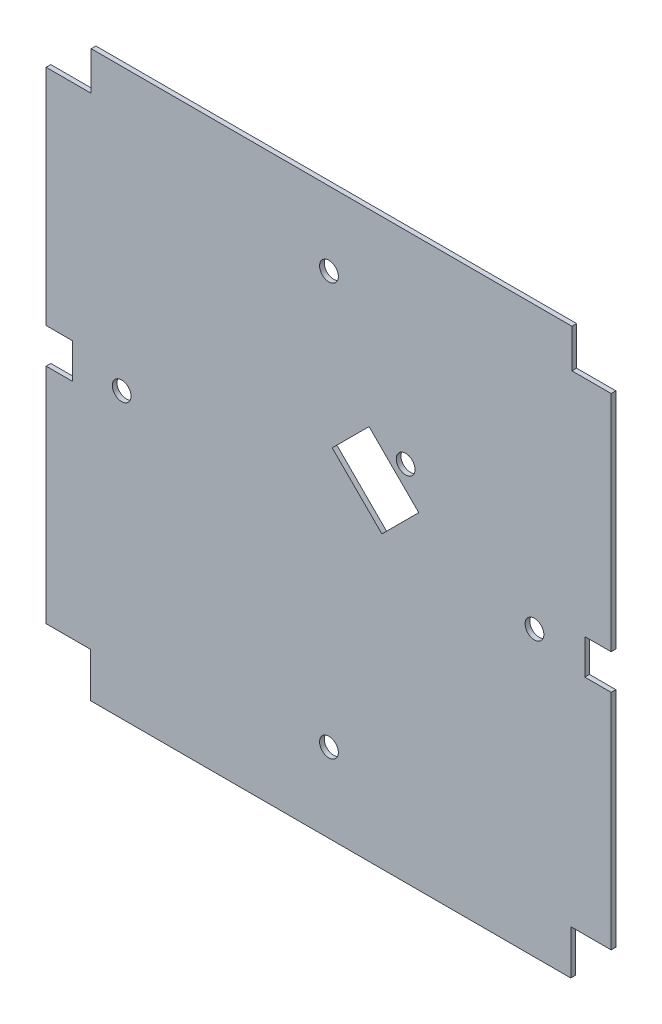
ISO-10303-21;
HEADER;
FILE_DESCRIPTION(('STEP AP214'),'2;1');
FILE_NAME('part.step','',(''),(''),'','','');
FILE_SCHEMA(('AUTOMOTIVE_DESIGN { 1 0 10303 214 1 1 1 1 }'));
ENDSEC;
DATA;
#1=APPLICATION_CONTEXT('core data for automotive mechanical design processes');
#2=APPLICATION_PROTOCOL_DEFINITION('international standard','automotive_design',2000,#1);
#3=PRODUCT_CONTEXT('',#1,'mechanical');
#4=PRODUCT('Part','Part','',(#3));
#5=PRODUCT_RELATED_PRODUCT_CATEGORY('part','',(#4));
#6=PRODUCT_DEFINITION_FORMATION('','',#4);
#7=PRODUCT_DEFINITION_CONTEXT('part definition',#1,'design');
#8=PRODUCT_DEFINITION('design','',#6,#7);
#9=PRODUCT_DEFINITION_SHAPE('','',#8);
#10=(LENGTH_UNIT() NAMED_UNIT(*) SI_UNIT(.MILLI.,.METRE.));
#11=(NAMED_UNIT(*) PLANE_ANGLE_UNIT() SI_UNIT($,.RADIAN.));
#12=(NAMED_UNIT(*) SI_UNIT($,.STERADIAN.) SOLID_ANGLE_UNIT());
#13=UNCERTAINTY_MEASURE_WITH_UNIT(LENGTH_MEASURE(1.E-05),#10,'distance_accuracy_value','');
#14=(GEOMETRIC_REPRESENTATION_CONTEXT(3) GLOBAL_UNCERTAINTY_ASSIGNED_CONTEXT((#13)) GLOBAL_UNIT_ASSIGNED_CONTEXT((#10,
#11,#12)) REPRESENTATION_CONTEXT('',''));
#15=CARTESIAN_POINT('',(0.,0.,0.));
#16=DIRECTION('',(0.,0.,1.));
#17=DIRECTION('',(1.,0.,0.));
#18=AXIS2_PLACEMENT_3D('',#15,#16,#17);
#19=CARTESIAN_POINT('',(0.,0.,0.8));
#20=DIRECTION('',(0.,0.,1.));
#21=DIRECTION('',(1.,0.,0.));
#22=AXIS2_PLACEMENT_3D('',#19,#20,#21);
#23=PLANE('',#22);
#24=CARTESIAN_POINT('',(-5.62473267197009,1.12696317266224,0.8));
#25=DIRECTION('',(0.,0.,1.));
#26=DIRECTION('',(1.,0.,0.));
#27=AXIS2_PLACEMENT_3D('',#24,#25,#26);
#28=CIRCLE('',#27,1.6);
#29=CARTESIAN_POINT('',(-4.02473267197009,1.12696317266224,0.8));
#30=VERTEX_POINT('',#29);
#31=EDGE_CURVE('E229',#30,#30,#28,.T.);
#32=ORIENTED_EDGE('',*,*,#31,.F.);
#33=EDGE_LOOP('',(#32));
#34=FACE_BOUND('',#33,.T.);
#35=CARTESIAN_POINT('',(-18.7247326719701,-47.2730368273378,0.8));
#36=DIRECTION('',(0.,0.,1.));
#37=DIRECTION('',(1.,0.,0.));
#38=AXIS2_PLACEMENT_3D('',#35,#36,#37);
#39=CIRCLE('',#38,1.6);
#40=CARTESIAN_POINT('',(-17.1247326719701,-47.2730368273378,0.8));
#41=VERTEX_POINT('',#40);
#42=EDGE_CURVE('E232',#41,#41,#39,.T.);
#43=ORIENTED_EDGE('',*,*,#42,.F.);
#44=EDGE_LOOP('',(#43));
#45=FACE_BOUND('',#44,.T.);
#46=CARTESIAN_POINT('',(16.3752673280299,-12.2730368273378,0.8));
#47=DIRECTION('',(0.,0.,1.));
#48=DIRECTION('',(1.,0.,0.));
#49=AXIS2_PLACEMENT_3D('',#46,#47,#48);
#50=CIRCLE('',#49,1.6);
#51=CARTESIAN_POINT('',(17.9752673280299,-12.2730368273378,0.8));
#52=VERTEX_POINT('',#51);
#53=EDGE_CURVE('E236',#52,#52,#50,.T.);
#54=ORIENTED_EDGE('',*,*,#53,.F.);
#55=EDGE_LOOP('',(#54));
#56=FACE_BOUND('',#55,.T.);
#57=CARTESIAN_POINT('',(-54.1247326719701,-12.2730368273378,0.8));
#58=DIRECTION('',(0.,0.,1.));
#59=DIRECTION('',(1.,0.,0.));
#60=AXIS2_PLACEMENT_3D('',#57,#58,#59);
#61=CIRCLE('',#60,1.6);
#62=CARTESIAN_POINT('',(-52.5247326719701,-12.2730368273378,0.8));
#63=VERTEX_POINT('',#62);
#64=EDGE_CURVE('E239',#63,#63,#61,.T.);
#65=ORIENTED_EDGE('',*,*,#64,.F.);
#66=EDGE_LOOP('',(#65));
#67=FACE_BOUND('',#66,.T.);
#68=CARTESIAN_POINT('',(-18.7247326719703,23.1269631726623,0.8));
#69=DIRECTION('',(0.,0.,1.));
#70=DIRECTION('',(1.,0.,0.));
#71=AXIS2_PLACEMENT_3D('',#68,#69,#70);
#72=CIRCLE('',#71,1.6000000000002);
#73=CARTESIAN_POINT('',(-17.1247326719701,23.1269631726623,0.8));
#74=VERTEX_POINT('',#73);
#75=EDGE_CURVE('E242',#74,#74,#72,.T.);
#76=ORIENTED_EDGE('',*,*,#75,.F.);
#77=EDGE_LOOP('',(#76));
#78=FACE_BOUND('',#77,.T.);
#79=DIRECTION('',(0.,1.,0.));
#80=VECTOR('',#79,1.);
#81=CARTESIAN_POINT('',(-59.42473267197,0.,0.8));
#82=LINE('',#81,#80);
#83=CARTESIAN_POINT('',(-59.4247326719701,-60.7730368273378,0.8));
#84=VERTEX_POINT('',#83);
#85=CARTESIAN_POINT('',(-59.4247326719701,-53.1730368273378,0.8));
#86=VERTEX_POINT('',#85);
#87=EDGE_CURVE('E245',#84,#86,#82,.T.);
#88=ORIENTED_EDGE('',*,*,#87,.F.);
#89=DIRECTION('',(1.,0.,0.));
#90=VECTOR('',#89,1.);
#91=CARTESIAN_POINT('',(0.,-60.7730368273378,0.8));
#92=LINE('',#91,#90);
#93=CARTESIAN_POINT('',(22.5752673280299,-60.7730368273378,0.8));
#94=VERTEX_POINT('',#93);
#95=EDGE_CURVE('E248',#84,#94,#92,.T.);
#96=ORIENTED_EDGE('',*,*,#95,.T.);
#97=DIRECTION('',(0.,1.,0.));
#98=VECTOR('',#97,1.);
#99=CARTESIAN_POINT('',(22.5752673280298,0.,0.8));
#100=LINE('',#99,#98);
#101=CARTESIAN_POINT('',(22.5752673280299,-53.1730368273378,0.8));
#102=VERTEX_POINT('',#101);
#103=EDGE_CURVE('E251',#94,#102,#100,.T.);
#104=ORIENTED_EDGE('',*,*,#103,.T.);
#105=DIRECTION('',(-1.,0.,0.));
#106=VECTOR('',#105,1.);
#107=CARTESIAN_POINT('',(0.,-53.1730368273378,0.8));
#108=LINE('',#107,#106);
#109=CARTESIAN_POINT('',(29.4752673280299,-53.1730368273378,0.8));
#110=VERTEX_POINT('',#109);
#111=EDGE_CURVE('E253',#110,#102,#108,.T.);
#112=ORIENTED_EDGE('',*,*,#111,.F.);
#113=DIRECTION('',(0.,-1.,0.));
#114=VECTOR('',#113,1.);
#115=CARTESIAN_POINT('',(29.4752673280299,0.,0.8));
#116=LINE('',#115,#114);
#117=CARTESIAN_POINT('',(29.4752673280299,-15.0730368273378,0.8));
#118=VERTEX_POINT('',#117);
#119=EDGE_CURVE('E256',#118,#110,#116,.T.);
#120=ORIENTED_EDGE('',*,*,#119,.F.);
#121=DIRECTION('',(-1.,0.,0.));
#122=VECTOR('',#121,1.);
#123=CARTESIAN_POINT('',(0.,-15.0730368273378,0.8));
#124=LINE('',#123,#122);
#125=CARTESIAN_POINT('',(24.9752673280299,-15.0730368273378,0.8));
#126=VERTEX_POINT('',#125);
#127=EDGE_CURVE('E259',#118,#126,#124,.T.);
#128=ORIENTED_EDGE('',*,*,#127,.T.);
#129=DIRECTION('',(0.,1.,0.));
#130=VECTOR('',#129,1.);
#131=CARTESIAN_POINT('',(24.9752673280299,0.,0.8));
#132=LINE('',#131,#130);
#133=CARTESIAN_POINT('',(24.9752673280299,-9.07303682733776,0.8));
#134=VERTEX_POINT('',#133);
#135=EDGE_CURVE('E263',#126,#134,#132,.T.);
#136=ORIENTED_EDGE('',*,*,#135,.T.);
#137=DIRECTION('',(-1.,0.,0.));
#138=VECTOR('',#137,1.);
#139=CARTESIAN_POINT('',(0.,-9.07303682733776,0.8));
#140=LINE('',#139,#138);
#141=CARTESIAN_POINT('',(29.4752673280299,-9.07303682733776,0.8));
#142=VERTEX_POINT('',#141);
#143=EDGE_CURVE('E265',#142,#134,#140,.T.);
#144=ORIENTED_EDGE('',*,*,#143,.F.);
#145=CARTESIAN_POINT('',(29.4752673280299,29.1269631726622,0.8));
#146=VERTEX_POINT('',#145);
#147=EDGE_CURVE('E260',#146,#142,#116,.T.);
#148=ORIENTED_EDGE('',*,*,#147,.F.);
#149=DIRECTION('',(-1.,0.,0.));
#150=VECTOR('',#149,1.);
#151=CARTESIAN_POINT('',(0.,29.1269631726622,0.8));
#152=LINE('',#151,#150);
#153=CARTESIAN_POINT('',(22.7752673280299,29.1269631726622,0.8));
#154=VERTEX_POINT('',#153);
#155=EDGE_CURVE('E268',#146,#154,#152,.T.);
#156=ORIENTED_EDGE('',*,*,#155,.T.);
#157=DIRECTION('',(0.,-1.,0.));
#158=VECTOR('',#157,1.);
#159=CARTESIAN_POINT('',(22.7752673280299,0.,0.8));
#160=LINE('',#159,#158);
#161=CARTESIAN_POINT('',(22.7752673280299,35.7269631726623,0.8));
#162=VERTEX_POINT('',#161);
#163=EDGE_CURVE('E270',#162,#154,#160,.T.);
#164=ORIENTED_EDGE('',*,*,#163,.F.);
#165=DIRECTION('',(1.,0.,0.));
#166=VECTOR('',#165,1.);
#167=CARTESIAN_POINT('',(0.,35.7269631726623,0.8));
#168=LINE('',#167,#166);
#169=CARTESIAN_POINT('',(-59.3247326719701,35.7269631726622,0.8));
#170=VERTEX_POINT('',#169);
#171=EDGE_CURVE('E273',#170,#162,#168,.T.);
#172=ORIENTED_EDGE('',*,*,#171,.F.);
#173=DIRECTION('',(0.,-1.,0.));
#174=VECTOR('',#173,1.);
#175=CARTESIAN_POINT('',(-59.3247326719701,0.,0.8));
#176=LINE('',#175,#174);
#177=CARTESIAN_POINT('',(-59.3247326719701,29.1269631726622,0.8));
#178=VERTEX_POINT('',#177);
#179=EDGE_CURVE('E276',#170,#178,#176,.T.);
#180=ORIENTED_EDGE('',*,*,#179,.T.);
#181=DIRECTION('',(1.,0.,0.));
#182=VECTOR('',#181,1.);
#183=CARTESIAN_POINT('',(0.,29.1269631726622,0.8));
#184=LINE('',#183,#182);
#185=CARTESIAN_POINT('',(-67.0247326719701,29.1269631726622,0.8));
#186=VERTEX_POINT('',#185);
#187=EDGE_CURVE('E278',#186,#178,#184,.T.);
#188=ORIENTED_EDGE('',*,*,#187,.F.);
#189=DIRECTION('',(0.,-1.,0.));
#190=VECTOR('',#189,1.);
#191=CARTESIAN_POINT('',(-67.0247326719701,0.,0.8));
#192=LINE('',#191,#190);
#193=CARTESIAN_POINT('',(-67.0247326719701,-9.07303682733776,0.8));
#194=VERTEX_POINT('',#193);
#195=EDGE_CURVE('E281',#186,#194,#192,.T.);
#196=ORIENTED_EDGE('',*,*,#195,.T.);
#197=DIRECTION('',(1.,0.,0.));
#198=VECTOR('',#197,1.);
#199=CARTESIAN_POINT('',(0.,-9.07303682733776,0.8));
#200=LINE('',#199,#198);
#201=CARTESIAN_POINT('',(-62.5247326719701,-9.07303682733776,0.8));
#202=VERTEX_POINT('',#201);
#203=EDGE_CURVE('E284',#194,#202,#200,.T.);
#204=ORIENTED_EDGE('',*,*,#203,.T.);
#205=DIRECTION('',(0.,-1.,0.));
#206=VECTOR('',#205,1.);
#207=CARTESIAN_POINT('',(-62.52473267197,1.44617495460321E-13,0.8));
#208=LINE('',#207,#206);
#209=CARTESIAN_POINT('',(-62.5247326719701,-15.0730368273378,0.8));
#210=VERTEX_POINT('',#209);
#211=EDGE_CURVE('E288',#202,#210,#208,.T.);
#212=ORIENTED_EDGE('',*,*,#211,.T.);
#213=DIRECTION('',(1.,0.,0.));
#214=VECTOR('',#213,1.);
#215=CARTESIAN_POINT('',(0.,-15.0730368273378,0.8));
#216=LINE('',#215,#214);
#217=CARTESIAN_POINT('',(-67.0247326719701,-15.0730368273378,0.8));
#218=VERTEX_POINT('',#217);
#219=EDGE_CURVE('E290',#218,#210,#216,.T.);
#220=ORIENTED_EDGE('',*,*,#219,.F.);
#221=CARTESIAN_POINT('',(-67.0247326719701,-53.1730368273378,0.8));
#222=VERTEX_POINT('',#221);
#223=EDGE_CURVE('E285',#218,#222,#192,.T.);
#224=ORIENTED_EDGE('',*,*,#223,.T.);
#225=DIRECTION('',(1.,0.,0.));
#226=VECTOR('',#225,1.);
#227=CARTESIAN_POINT('',(0.,-53.1730368273377,0.8));
#228=LINE('',#227,#226);
#229=EDGE_CURVE('E293',#222,#86,#228,.T.);
#230=ORIENTED_EDGE('',*,*,#229,.T.);
#231=EDGE_LOOP('',(#88,#96,#104,#112,#120,#128,#136,#144,#148,#156,#164,#172,#180,#188,#196,
#204,#212,#220,#224,#230));
#232=FACE_BOUND('',#231,.T.);
#233=DIRECTION('',(0.707106781186546,-0.707106781186549,0.));
#234=VECTOR('',#233,1.);
#235=CARTESIAN_POINT('',(-4.15736690971228,-4.15736690971226,0.8));
#236=LINE('',#235,#234);
#237=CARTESIAN_POINT('',(-11.8758555191477,3.56112169972318,0.8));
#238=VERTEX_POINT('',#237);
#239=CARTESIAN_POINT('',(-3.39057414490914,-4.9241596745154,0.8));
#240=VERTEX_POINT('',#239);
#241=EDGE_CURVE('E219',#238,#240,#236,.T.);
#242=ORIENTED_EDGE('',*,*,#241,.T.);
#243=DIRECTION('',(-0.707106781186549,-0.707106781186546,0.));
#244=VECTOR('',#243,1.);
#245=CARTESIAN_POINT('',(0.766792764803138,-0.766792764803142,0.8));
#246=LINE('',#245,#244);
#247=CARTESIAN_POINT('',(-9.68382449746942,-11.2174100270757,0.8));
#248=VERTEX_POINT('',#247);
#249=EDGE_CURVE('E48',#240,#248,#246,.T.);
#250=ORIENTED_EDGE('',*,*,#249,.T.);
#251=DIRECTION('',(0.707106781186546,-0.707106781186549,0.));
#252=VECTOR('',#251,1.);
#253=CARTESIAN_POINT('',(-10.4506172622726,-10.4506172622725,0.8));
#254=LINE('',#253,#252);
#255=CARTESIAN_POINT('',(-18.169105871708,-2.73212865283708,0.8));
#256=VERTEX_POINT('',#255);
#257=EDGE_CURVE('E210',#256,#248,#254,.T.);
#258=ORIENTED_EDGE('',*,*,#257,.F.);
#259=DIRECTION('',(-0.707106781186549,-0.707106781186546,0.));
#260=VECTOR('',#259,1.);
#261=CARTESIAN_POINT('',(-7.71848860943541,7.71848860943545,0.8));
#262=LINE('',#261,#260);
#263=EDGE_CURVE('E213',#238,#256,#262,.T.);
#264=ORIENTED_EDGE('',*,*,#263,.F.);
#265=EDGE_LOOP('',(#242,#250,#258,#264));
#266=FACE_BOUND('',#265,.T.);
#267=ADVANCED_FACE('F33',(#34,#45,#56,#67,#78,#232,#266),#23,.T.);
#268=CARTESIAN_POINT('',(0.,0.,0.));
#269=DIRECTION('',(0.,0.,1.));
#270=DIRECTION('',(1.,0.,0.));
#271=AXIS2_PLACEMENT_3D('',#268,#269,#270);
#272=PLANE('',#271);
#273=DIRECTION('',(0.,1.,0.));
#274=VECTOR('',#273,1.);
#275=CARTESIAN_POINT('',(-59.42473267197,0.,0.));
#276=LINE('',#275,#274);
#277=CARTESIAN_POINT('',(-59.4247326719701,-60.7730368273378,0.));
#278=VERTEX_POINT('',#277);
#279=CARTESIAN_POINT('',(-59.4247326719701,-53.1730368273378,0.));
#280=VERTEX_POINT('',#279);
#281=EDGE_CURVE('E310',#278,#280,#276,.T.);
#282=ORIENTED_EDGE('',*,*,#281,.T.);
#283=DIRECTION('',(1.,0.,0.));
#284=VECTOR('',#283,1.);
#285=CARTESIAN_POINT('',(0.,-53.1730368273377,0.));
#286=LINE('',#285,#284);
#287=CARTESIAN_POINT('',(-67.0247326719701,-53.1730368273378,0.));
#288=VERTEX_POINT('',#287);
#289=EDGE_CURVE('E233',#288,#280,#286,.T.);
#290=ORIENTED_EDGE('',*,*,#289,.F.);
#291=DIRECTION('',(0.,-1.,0.));
#292=VECTOR('',#291,1.);
#293=CARTESIAN_POINT('',(-67.0247326719701,0.,0.));
#294=LINE('',#293,#292);
#295=CARTESIAN_POINT('',(-67.0247326719701,-15.0730368273378,0.));
#296=VERTEX_POINT('',#295);
#297=EDGE_CURVE('E354',#296,#288,#294,.T.);
#298=ORIENTED_EDGE('',*,*,#297,.F.);
#299=DIRECTION('',(1.,0.,0.));
#300=VECTOR('',#299,1.);
#301=CARTESIAN_POINT('',(0.,-15.0730368273378,0.));
#302=LINE('',#301,#300);
#303=CARTESIAN_POINT('',(-62.5247326719701,-15.0730368273378,0.));
#304=VERTEX_POINT('',#303);
#305=EDGE_CURVE('E360',#296,#304,#302,.T.);
#306=ORIENTED_EDGE('',*,*,#305,.T.);
#307=DIRECTION('',(0.,-1.,0.));
#308=VECTOR('',#307,1.);
#309=CARTESIAN_POINT('',(-62.52473267197,1.44617495460321E-13,0.));
#310=LINE('',#309,#308);
#311=CARTESIAN_POINT('',(-62.5247326719701,-9.07303682733776,0.));
#312=VERTEX_POINT('',#311);
#313=EDGE_CURVE('E357',#312,#304,#310,.T.);
#314=ORIENTED_EDGE('',*,*,#313,.F.);
#315=DIRECTION('',(1.,0.,0.));
#316=VECTOR('',#315,1.);
#317=CARTESIAN_POINT('',(0.,-9.07303682733776,0.));
#318=LINE('',#317,#316);
#319=CARTESIAN_POINT('',(-67.0247326719701,-9.07303682733776,0.));
#320=VERTEX_POINT('',#319);
#321=EDGE_CURVE('E353',#320,#312,#318,.T.);
#322=ORIENTED_EDGE('',*,*,#321,.F.);
#323=CARTESIAN_POINT('',(-67.0247326719701,29.1269631726622,0.));
#324=VERTEX_POINT('',#323);
#325=EDGE_CURVE('E350',#324,#320,#294,.T.);
#326=ORIENTED_EDGE('',*,*,#325,.F.);
#327=DIRECTION('',(1.,0.,0.));
#328=VECTOR('',#327,1.);
#329=CARTESIAN_POINT('',(0.,29.1269631726622,0.));
#330=LINE('',#329,#328);
#331=CARTESIAN_POINT('',(-59.3247326719701,29.1269631726622,0.));
#332=VERTEX_POINT('',#331);
#333=EDGE_CURVE('E347',#324,#332,#330,.T.);
#334=ORIENTED_EDGE('',*,*,#333,.T.);
#335=DIRECTION('',(0.,-1.,0.));
#336=VECTOR('',#335,1.);
#337=CARTESIAN_POINT('',(-59.3247326719701,0.,0.));
#338=LINE('',#337,#336);
#339=CARTESIAN_POINT('',(-59.3247326719701,35.7269631726622,0.));
#340=VERTEX_POINT('',#339);
#341=EDGE_CURVE('E344',#340,#332,#338,.T.);
#342=ORIENTED_EDGE('',*,*,#341,.F.);
#343=DIRECTION('',(1.,0.,0.));
#344=VECTOR('',#343,1.);
#345=CARTESIAN_POINT('',(0.,35.7269631726623,0.));
#346=LINE('',#345,#344);
#347=CARTESIAN_POINT('',(22.7752673280299,35.7269631726623,0.));
#348=VERTEX_POINT('',#347);
#349=EDGE_CURVE('E341',#340,#348,#346,.T.);
#350=ORIENTED_EDGE('',*,*,#349,.T.);
#351=DIRECTION('',(0.,-1.,0.));
#352=VECTOR('',#351,1.);
#353=CARTESIAN_POINT('',(22.7752673280299,0.,0.));
#354=LINE('',#353,#352);
#355=CARTESIAN_POINT('',(22.7752673280299,29.1269631726622,0.));
#356=VERTEX_POINT('',#355);
#357=EDGE_CURVE('E338',#348,#356,#354,.T.);
#358=ORIENTED_EDGE('',*,*,#357,.T.);
#359=DIRECTION('',(-1.,0.,0.));
#360=VECTOR('',#359,1.);
#361=CARTESIAN_POINT('',(0.,29.1269631726622,0.));
#362=LINE('',#361,#360);
#363=CARTESIAN_POINT('',(29.4752673280299,29.1269631726622,0.));
#364=VERTEX_POINT('',#363);
#365=EDGE_CURVE('E335',#364,#356,#362,.T.);
#366=ORIENTED_EDGE('',*,*,#365,.F.);
#367=DIRECTION('',(0.,-1.,0.));
#368=VECTOR('',#367,1.);
#369=CARTESIAN_POINT('',(29.4752673280299,0.,0.));
#370=LINE('',#369,#368);
#371=CARTESIAN_POINT('',(29.4752673280299,-9.07303682733776,0.));
#372=VERTEX_POINT('',#371);
#373=EDGE_CURVE('E326',#364,#372,#370,.T.);
#374=ORIENTED_EDGE('',*,*,#373,.T.);
#375=DIRECTION('',(-1.,0.,0.));
#376=VECTOR('',#375,1.);
#377=CARTESIAN_POINT('',(0.,-9.07303682733776,0.));
#378=LINE('',#377,#376);
#379=CARTESIAN_POINT('',(24.9752673280299,-9.07303682733776,0.));
#380=VERTEX_POINT('',#379);
#381=EDGE_CURVE('E332',#372,#380,#378,.T.);
#382=ORIENTED_EDGE('',*,*,#381,.T.);
#383=DIRECTION('',(0.,1.,0.));
#384=VECTOR('',#383,1.);
#385=CARTESIAN_POINT('',(24.9752673280299,0.,0.));
#386=LINE('',#385,#384);
#387=CARTESIAN_POINT('',(24.9752673280299,-15.0730368273378,0.));
#388=VERTEX_POINT('',#387);
#389=EDGE_CURVE('E329',#388,#380,#386,.T.);
#390=ORIENTED_EDGE('',*,*,#389,.F.);
#391=DIRECTION('',(-1.,0.,0.));
#392=VECTOR('',#391,1.);
#393=CARTESIAN_POINT('',(0.,-15.0730368273378,0.));
#394=LINE('',#393,#392);
#395=CARTESIAN_POINT('',(29.4752673280299,-15.0730368273378,0.));
#396=VERTEX_POINT('',#395);
#397=EDGE_CURVE('E325',#396,#388,#394,.T.);
#398=ORIENTED_EDGE('',*,*,#397,.F.);
#399=CARTESIAN_POINT('',(29.4752673280299,-53.1730368273378,0.));
#400=VERTEX_POINT('',#399);
#401=EDGE_CURVE('E322',#396,#400,#370,.T.);
#402=ORIENTED_EDGE('',*,*,#401,.T.);
#403=DIRECTION('',(-1.,0.,0.));
#404=VECTOR('',#403,1.);
#405=CARTESIAN_POINT('',(0.,-53.1730368273378,0.));
#406=LINE('',#405,#404);
#407=CARTESIAN_POINT('',(22.5752673280299,-53.1730368273378,0.));
#408=VERTEX_POINT('',#407);
#409=EDGE_CURVE('E319',#400,#408,#406,.T.);
#410=ORIENTED_EDGE('',*,*,#409,.T.);
#411=DIRECTION('',(0.,1.,0.));
#412=VECTOR('',#411,1.);
#413=CARTESIAN_POINT('',(22.5752673280298,0.,0.));
#414=LINE('',#413,#412);
#415=CARTESIAN_POINT('',(22.5752673280299,-60.7730368273378,0.));
#416=VERTEX_POINT('',#415);
#417=EDGE_CURVE('E316',#416,#408,#414,.T.);
#418=ORIENTED_EDGE('',*,*,#417,.F.);
#419=DIRECTION('',(1.,0.,0.));
#420=VECTOR('',#419,1.);
#421=CARTESIAN_POINT('',(0.,-60.7730368273378,0.));
#422=LINE('',#421,#420);
#423=EDGE_CURVE('E313',#278,#416,#422,.T.);
#424=ORIENTED_EDGE('',*,*,#423,.F.);
#425=EDGE_LOOP('',(#282,#290,#298,#306,#314,#322,#326,#334,#342,#350,#358,#366,#374,#382,#390,
#398,#402,#410,#418,#424));
#426=FACE_BOUND('',#425,.T.);
#427=CARTESIAN_POINT('',(-18.7247326719703,23.1269631726623,0.));
#428=DIRECTION('',(0.,0.,1.));
#429=DIRECTION('',(1.,0.,0.));
#430=AXIS2_PLACEMENT_3D('',#427,#428,#429);
#431=CIRCLE('',#430,1.6000000000002);
#432=CARTESIAN_POINT('',(-17.1247326719701,23.1269631726623,0.));
#433=VERTEX_POINT('',#432);
#434=EDGE_CURVE('E307',#433,#433,#431,.T.);
#435=ORIENTED_EDGE('',*,*,#434,.T.);
#436=EDGE_LOOP('',(#435));
#437=FACE_BOUND('',#436,.T.);
#438=CARTESIAN_POINT('',(-54.1247326719701,-12.2730368273378,0.));
#439=DIRECTION('',(0.,0.,1.));
#440=DIRECTION('',(1.,0.,0.));
#441=AXIS2_PLACEMENT_3D('',#438,#439,#440);
#442=CIRCLE('',#441,1.6);
#443=CARTESIAN_POINT('',(-52.5247326719701,-12.2730368273378,0.));
#444=VERTEX_POINT('',#443);
#445=EDGE_CURVE('E304',#444,#444,#442,.T.);
#446=ORIENTED_EDGE('',*,*,#445,.T.);
#447=EDGE_LOOP('',(#446));
#448=FACE_BOUND('',#447,.T.);
#449=CARTESIAN_POINT('',(16.3752673280299,-12.2730368273378,0.));
#450=DIRECTION('',(0.,0.,1.));
#451=DIRECTION('',(1.,0.,0.));
#452=AXIS2_PLACEMENT_3D('',#449,#450,#451);
#453=CIRCLE('',#452,1.6);
#454=CARTESIAN_POINT('',(17.9752673280299,-12.2730368273378,0.));
#455=VERTEX_POINT('',#454);
#456=EDGE_CURVE('E301',#455,#455,#453,.T.);
#457=ORIENTED_EDGE('',*,*,#456,.T.);
#458=EDGE_LOOP('',(#457));
#459=FACE_BOUND('',#458,.T.);
#460=CARTESIAN_POINT('',(-18.7247326719701,-47.2730368273378,0.));
#461=DIRECTION('',(0.,0.,1.));
#462=DIRECTION('',(1.,0.,0.));
#463=AXIS2_PLACEMENT_3D('',#460,#461,#462);
#464=CIRCLE('',#463,1.6);
#465=CARTESIAN_POINT('',(-17.1247326719701,-47.2730368273378,0.));
#466=VERTEX_POINT('',#465);
#467=EDGE_CURVE('E298',#466,#466,#464,.T.);
#468=ORIENTED_EDGE('',*,*,#467,.T.);
#469=EDGE_LOOP('',(#468));
#470=FACE_BOUND('',#469,.T.);
#471=CARTESIAN_POINT('',(-5.62473267197009,1.12696317266224,0.));
#472=DIRECTION('',(0.,0.,1.));
#473=DIRECTION('',(1.,0.,0.));
#474=AXIS2_PLACEMENT_3D('',#471,#472,#473);
#475=CIRCLE('',#474,1.6);
#476=CARTESIAN_POINT('',(-4.02473267197009,1.12696317266224,0.));
#477=VERTEX_POINT('',#476);
#478=EDGE_CURVE('E225',#477,#477,#475,.T.);
#479=ORIENTED_EDGE('',*,*,#478,.T.);
#480=EDGE_LOOP('',(#479));
#481=FACE_BOUND('',#480,.T.);
#482=DIRECTION('',(-0.707106781186549,-0.707106781186546,0.));
#483=VECTOR('',#482,1.);
#484=CARTESIAN_POINT('',(0.766792764803138,-0.766792764803142,0.));
#485=LINE('',#484,#483);
#486=CARTESIAN_POINT('',(-3.39057414490914,-4.9241596745154,0.));
#487=VERTEX_POINT('',#486);
#488=CARTESIAN_POINT('',(-9.68382449746942,-11.2174100270757,0.));
#489=VERTEX_POINT('',#488);
#490=EDGE_CURVE('E201',#487,#489,#485,.T.);
#491=ORIENTED_EDGE('',*,*,#490,.F.);
#492=DIRECTION('',(0.707106781186546,-0.707106781186549,0.));
#493=VECTOR('',#492,1.);
#494=CARTESIAN_POINT('',(-4.15736690971228,-4.15736690971226,0.));
#495=LINE('',#494,#493);
#496=CARTESIAN_POINT('',(-11.8758555191477,3.56112169972318,0.));
#497=VERTEX_POINT('',#496);
#498=EDGE_CURVE('E193',#497,#487,#495,.T.);
#499=ORIENTED_EDGE('',*,*,#498,.F.);
#500=DIRECTION('',(-0.707106781186549,-0.707106781186546,0.));
#501=VECTOR('',#500,1.);
#502=CARTESIAN_POINT('',(-7.71848860943541,7.71848860943545,0.));
#503=LINE('',#502,#501);
#504=CARTESIAN_POINT('',(-18.169105871708,-2.73212865283708,0.));
#505=VERTEX_POINT('',#504);
#506=EDGE_CURVE('E56',#497,#505,#503,.T.);
#507=ORIENTED_EDGE('',*,*,#506,.T.);
#508=DIRECTION('',(0.707106781186546,-0.707106781186549,0.));
#509=VECTOR('',#508,1.);
#510=CARTESIAN_POINT('',(-10.4506172622726,-10.4506172622725,0.));
#511=LINE('',#510,#509);
#512=EDGE_CURVE('E205',#505,#489,#511,.T.);
#513=ORIENTED_EDGE('',*,*,#512,.T.);
#514=EDGE_LOOP('',(#491,#499,#507,#513));
#515=FACE_BOUND('',#514,.T.);
#516=ADVANCED_FACE('F208',(#426,#437,#448,#459,#470,#481,#515),#272,.F.);
#517=CARTESIAN_POINT('',(-59.42473267197,0.,0.8));
#518=DIRECTION('',(-1.,0.,0.));
#519=DIRECTION('',(0.,-1.,0.));
#520=AXIS2_PLACEMENT_3D('',#517,#518,#519);
#521=PLANE('',#520);
#522=ORIENTED_EDGE('',*,*,#281,.F.);
#523=DIRECTION('',(0.,0.,-1.));
#524=VECTOR('',#523,1.);
#525=CARTESIAN_POINT('',(-59.4247326719701,-60.7730368273378,0.8));
#526=LINE('',#525,#524);
#527=EDGE_CURVE('E11',#84,#278,#526,.T.);
#528=ORIENTED_EDGE('',*,*,#527,.F.);
#529=ORIENTED_EDGE('',*,*,#87,.T.);
#530=DIRECTION('',(0.,0.,-1.));
#531=VECTOR('',#530,1.);
#532=CARTESIAN_POINT('',(-59.4247326719701,-53.1730368273378,0.8));
#533=LINE('',#532,#531);
#534=EDGE_CURVE('E295',#86,#280,#533,.T.);
#535=ORIENTED_EDGE('',*,*,#534,.T.);
#536=EDGE_LOOP('',(#522,#528,#529,#535));
#537=FACE_BOUND('',#536,.T.);
#538=ADVANCED_FACE('F416',(#537),#521,.T.);
#539=CARTESIAN_POINT('',(0.,-60.7730368273378,0.8));
#540=DIRECTION('',(0.,1.,0.));
#541=DIRECTION('',(0.,0.,1.));
#542=AXIS2_PLACEMENT_3D('',#539,#540,#541);
#543=PLANE('',#542);
#544=ORIENTED_EDGE('',*,*,#423,.T.);
#545=DIRECTION('',(0.,0.,-1.));
#546=VECTOR('',#545,1.);
#547=CARTESIAN_POINT('',(22.5752673280299,-60.7730368273378,0.8));
#548=LINE('',#547,#546);
#549=EDGE_CURVE('E41',#94,#416,#548,.T.);
#550=ORIENTED_EDGE('',*,*,#549,.F.);
#551=ORIENTED_EDGE('',*,*,#95,.F.);
#552=ORIENTED_EDGE('',*,*,#527,.T.);
#553=EDGE_LOOP('',(#544,#550,#551,#552));
#554=FACE_BOUND('',#553,.T.);
#555=ADVANCED_FACE('F411',(#554),#543,.F.);
#556=CARTESIAN_POINT('',(22.5752673280298,0.,0.8));
#557=DIRECTION('',(-1.,0.,0.));
#558=DIRECTION('',(0.,-1.,0.));
#559=AXIS2_PLACEMENT_3D('',#556,#557,#558);
#560=PLANE('',#559);
#561=ORIENTED_EDGE('',*,*,#417,.T.);
#562=DIRECTION('',(0.,0.,-1.));
#563=VECTOR('',#562,1.);
#564=CARTESIAN_POINT('',(22.5752673280299,-53.1730368273378,0.8));
#565=LINE('',#564,#563);
#566=EDGE_CURVE('E402',#102,#408,#565,.T.);
#567=ORIENTED_EDGE('',*,*,#566,.F.);
#568=ORIENTED_EDGE('',*,*,#103,.F.);
#569=ORIENTED_EDGE('',*,*,#549,.T.);
#570=EDGE_LOOP('',(#561,#567,#568,#569));
#571=FACE_BOUND('',#570,.T.);
#572=ADVANCED_FACE('F406',(#571),#560,.F.);
#573=CARTESIAN_POINT('',(0.,-53.1730368273378,0.8));
#574=DIRECTION('',(0.,-1.,0.));
#575=DIRECTION('',(0.,0.,-1.));
#576=AXIS2_PLACEMENT_3D('',#573,#574,#575);
#577=PLANE('',#576);
#578=ORIENTED_EDGE('',*,*,#409,.F.);
#579=DIRECTION('',(0.,0.,-1.));
#580=VECTOR('',#579,1.);
#581=CARTESIAN_POINT('',(29.4752673280299,-53.1730368273378,0.8));
#582=LINE('',#581,#580);
#583=EDGE_CURVE('E400',#110,#400,#582,.T.);
#584=ORIENTED_EDGE('',*,*,#583,.F.);
#585=ORIENTED_EDGE('',*,*,#111,.T.);
#586=ORIENTED_EDGE('',*,*,#566,.T.);
#587=EDGE_LOOP('',(#578,#584,#585,#586));
#588=FACE_BOUND('',#587,.T.);
#589=ADVANCED_FACE('F485',(#588),#577,.T.);
#590=CARTESIAN_POINT('',(29.4752673280299,0.,0.8));
#591=DIRECTION('',(1.,0.,0.));
#592=DIRECTION('',(0.,1.,0.));
#593=AXIS2_PLACEMENT_3D('',#590,#591,#592);
#594=PLANE('',#593);
#595=ORIENTED_EDGE('',*,*,#401,.F.);
#596=DIRECTION('',(0.,0.,-1.));
#597=VECTOR('',#596,1.);
#598=CARTESIAN_POINT('',(29.4752673280299,-15.0730368273378,0.8));
#599=LINE('',#598,#597);
#600=EDGE_CURVE('E398',#118,#396,#599,.T.);
#601=ORIENTED_EDGE('',*,*,#600,.F.);
#602=ORIENTED_EDGE('',*,*,#119,.T.);
#603=ORIENTED_EDGE('',*,*,#583,.T.);
#604=EDGE_LOOP('',(#595,#601,#602,#603));
#605=FACE_BOUND('',#604,.T.);
#606=ADVANCED_FACE('F482',(#605),#594,.T.);
#607=CARTESIAN_POINT('',(0.,-15.0730368273378,0.8));
#608=DIRECTION('',(0.,-1.,0.));
#609=DIRECTION('',(0.,0.,-1.));
#610=AXIS2_PLACEMENT_3D('',#607,#608,#609);
#611=PLANE('',#610);
#612=ORIENTED_EDGE('',*,*,#397,.T.);
#613=DIRECTION('',(0.,0.,-1.));
#614=VECTOR('',#613,1.);
#615=CARTESIAN_POINT('',(24.9752673280299,-15.0730368273378,0.8));
#616=LINE('',#615,#614);
#617=EDGE_CURVE('E395',#126,#388,#616,.T.);
#618=ORIENTED_EDGE('',*,*,#617,.F.);
#619=ORIENTED_EDGE('',*,*,#127,.F.);
#620=ORIENTED_EDGE('',*,*,#600,.T.);
#621=EDGE_LOOP('',(#612,#618,#619,#620));
#622=FACE_BOUND('',#621,.T.);
#623=ADVANCED_FACE('F479',(#622),#611,.F.);
#624=CARTESIAN_POINT('',(24.9752673280299,0.,0.8));
#625=DIRECTION('',(-1.,0.,0.));
#626=DIRECTION('',(0.,0.,1.));
#627=AXIS2_PLACEMENT_3D('',#624,#625,#626);
#628=PLANE('',#627);
#629=ORIENTED_EDGE('',*,*,#389,.T.);
#630=DIRECTION('',(0.,0.,-1.));
#631=VECTOR('',#630,1.);
#632=CARTESIAN_POINT('',(24.9752673280299,-9.07303682733776,0.8));
#633=LINE('',#632,#631);
#634=EDGE_CURVE('E393',#134,#380,#633,.T.);
#635=ORIENTED_EDGE('',*,*,#634,.F.);
#636=ORIENTED_EDGE('',*,*,#135,.F.);
#637=ORIENTED_EDGE('',*,*,#617,.T.);
#638=EDGE_LOOP('',(#629,#635,#636,#637));
#639=FACE_BOUND('',#638,.T.);
#640=ADVANCED_FACE('F476',(#639),#628,.F.);
#641=CARTESIAN_POINT('',(0.,-9.07303682733776,0.8));
#642=DIRECTION('',(0.,-1.,0.));
#643=DIRECTION('',(0.,0.,-1.));
#644=AXIS2_PLACEMENT_3D('',#641,#642,#643);
#645=PLANE('',#644);
#646=ORIENTED_EDGE('',*,*,#381,.F.);
#647=DIRECTION('',(0.,0.,-1.));
#648=VECTOR('',#647,1.);
#649=CARTESIAN_POINT('',(29.4752673280299,-9.07303682733776,0.8));
#650=LINE('',#649,#648);
#651=EDGE_CURVE('E391',#142,#372,#650,.T.);
#652=ORIENTED_EDGE('',*,*,#651,.F.);
#653=ORIENTED_EDGE('',*,*,#143,.T.);
#654=ORIENTED_EDGE('',*,*,#634,.T.);
#655=EDGE_LOOP('',(#646,#652,#653,#654));
#656=FACE_BOUND('',#655,.T.);
#657=ADVANCED_FACE('F470',(#656),#645,.T.);
#658=ORIENTED_EDGE('',*,*,#373,.F.);
#659=DIRECTION('',(0.,0.,-1.));
#660=VECTOR('',#659,1.);
#661=CARTESIAN_POINT('',(29.4752673280299,29.1269631726622,0.8));
#662=LINE('',#661,#660);
#663=EDGE_CURVE('E389',#146,#364,#662,.T.);
#664=ORIENTED_EDGE('',*,*,#663,.F.);
#665=ORIENTED_EDGE('',*,*,#147,.T.);
#666=ORIENTED_EDGE('',*,*,#651,.T.);
#667=EDGE_LOOP('',(#658,#664,#665,#666));
#668=FACE_BOUND('',#667,.T.);
#669=ADVANCED_FACE('F463',(#668),#594,.T.);
#670=CARTESIAN_POINT('',(0.,29.1269631726622,0.8));
#671=DIRECTION('',(0.,-1.,0.));
#672=DIRECTION('',(1.,0.,0.));
#673=AXIS2_PLACEMENT_3D('',#670,#671,#672);
#674=PLANE('',#673);
#675=ORIENTED_EDGE('',*,*,#365,.T.);
#676=DIRECTION('',(0.,0.,-1.));
#677=VECTOR('',#676,1.);
#678=CARTESIAN_POINT('',(22.7752673280299,29.1269631726622,0.8));
#679=LINE('',#678,#677);
#680=EDGE_CURVE('E387',#154,#356,#679,.T.);
#681=ORIENTED_EDGE('',*,*,#680,.F.);
#682=ORIENTED_EDGE('',*,*,#155,.F.);
#683=ORIENTED_EDGE('',*,*,#663,.T.);
#684=EDGE_LOOP('',(#675,#681,#682,#683));
#685=FACE_BOUND('',#684,.T.);
#686=ADVANCED_FACE('F557',(#685),#674,.F.);
#687=CARTESIAN_POINT('',(22.7752673280299,0.,0.8));
#688=DIRECTION('',(1.,0.,0.));
#689=DIRECTION('',(0.,1.,0.));
#690=AXIS2_PLACEMENT_3D('',#687,#688,#689);
#691=PLANE('',#690);
#692=ORIENTED_EDGE('',*,*,#357,.F.);
#693=DIRECTION('',(0.,0.,-1.));
#694=VECTOR('',#693,1.);
#695=CARTESIAN_POINT('',(22.7752673280299,35.7269631726623,0.8));
#696=LINE('',#695,#694);
#697=EDGE_CURVE('E385',#162,#348,#696,.T.);
#698=ORIENTED_EDGE('',*,*,#697,.F.);
#699=ORIENTED_EDGE('',*,*,#163,.T.);
#700=ORIENTED_EDGE('',*,*,#680,.T.);
#701=EDGE_LOOP('',(#692,#698,#699,#700));
#702=FACE_BOUND('',#701,.T.);
#703=ADVANCED_FACE('F456',(#702),#691,.T.);
#704=CARTESIAN_POINT('',(0.,35.7269631726623,0.8));
#705=DIRECTION('',(0.,1.,0.));
#706=DIRECTION('',(-1.,0.,0.));
#707=AXIS2_PLACEMENT_3D('',#704,#705,#706);
#708=PLANE('',#707);
#709=ORIENTED_EDGE('',*,*,#349,.F.);
#710=DIRECTION('',(0.,0.,-1.));
#711=VECTOR('',#710,1.);
#712=CARTESIAN_POINT('',(-59.3247326719701,35.7269631726622,0.8));
#713=LINE('',#712,#711);
#714=EDGE_CURVE('E383',#170,#340,#713,.T.);
#715=ORIENTED_EDGE('',*,*,#714,.F.);
#716=ORIENTED_EDGE('',*,*,#171,.T.);
#717=ORIENTED_EDGE('',*,*,#697,.T.);
#718=EDGE_LOOP('',(#709,#715,#716,#717));
#719=FACE_BOUND('',#718,.T.);
#720=ADVANCED_FACE('F450',(#719),#708,.T.);
#721=CARTESIAN_POINT('',(-59.3247326719701,0.,0.8));
#722=DIRECTION('',(1.,0.,0.));
#723=DIRECTION('',(0.,0.,-1.));
#724=AXIS2_PLACEMENT_3D('',#721,#722,#723);
#725=PLANE('',#724);
#726=ORIENTED_EDGE('',*,*,#341,.T.);
#727=DIRECTION('',(0.,0.,-1.));
#728=VECTOR('',#727,1.);
#729=CARTESIAN_POINT('',(-59.3247326719701,29.1269631726622,0.8));
#730=LINE('',#729,#728);
#731=EDGE_CURVE('E381',#178,#332,#730,.T.);
#732=ORIENTED_EDGE('',*,*,#731,.F.);
#733=ORIENTED_EDGE('',*,*,#179,.F.);
#734=ORIENTED_EDGE('',*,*,#714,.T.);
#735=EDGE_LOOP('',(#726,#732,#733,#734));
#736=FACE_BOUND('',#735,.T.);
#737=ADVANCED_FACE('F564',(#736),#725,.F.);
#738=CARTESIAN_POINT('',(0.,29.1269631726622,0.8));
#739=DIRECTION('',(0.,1.,0.));
#740=DIRECTION('',(-1.,0.,0.));
#741=AXIS2_PLACEMENT_3D('',#738,#739,#740);
#742=PLANE('',#741);
#743=ORIENTED_EDGE('',*,*,#333,.F.);
#744=DIRECTION('',(0.,0.,-1.));
#745=VECTOR('',#744,1.);
#746=CARTESIAN_POINT('',(-67.0247326719701,29.1269631726622,0.8));
#747=LINE('',#746,#745);
#748=EDGE_CURVE('E379',#186,#324,#747,.T.);
#749=ORIENTED_EDGE('',*,*,#748,.F.);
#750=ORIENTED_EDGE('',*,*,#187,.T.);
#751=ORIENTED_EDGE('',*,*,#731,.T.);
#752=EDGE_LOOP('',(#743,#749,#750,#751));
#753=FACE_BOUND('',#752,.T.);
#754=ADVANCED_FACE('F444',(#753),#742,.T.);
#755=CARTESIAN_POINT('',(-67.0247326719701,0.,0.8));
#756=DIRECTION('',(1.,0.,0.));
#757=DIRECTION('',(0.,1.,0.));
#758=AXIS2_PLACEMENT_3D('',#755,#756,#757);
#759=PLANE('',#758);
#760=ORIENTED_EDGE('',*,*,#325,.T.);
#761=DIRECTION('',(0.,0.,-1.));
#762=VECTOR('',#761,1.);
#763=CARTESIAN_POINT('',(-67.0247326719701,-9.07303682733776,0.8));
#764=LINE('',#763,#762);
#765=EDGE_CURVE('E376',#194,#320,#764,.T.);
#766=ORIENTED_EDGE('',*,*,#765,.F.);
#767=ORIENTED_EDGE('',*,*,#195,.F.);
#768=ORIENTED_EDGE('',*,*,#748,.T.);
#769=EDGE_LOOP('',(#760,#766,#767,#768));
#770=FACE_BOUND('',#769,.T.);
#771=ADVANCED_FACE('F441',(#770),#759,.F.);
#772=CARTESIAN_POINT('',(0.,-9.07303682733776,0.8));
#773=DIRECTION('',(0.,1.,0.));
#774=DIRECTION('',(0.,0.,1.));
#775=AXIS2_PLACEMENT_3D('',#772,#773,#774);
#776=PLANE('',#775);
#777=ORIENTED_EDGE('',*,*,#321,.T.);
#778=DIRECTION('',(0.,0.,-1.));
#779=VECTOR('',#778,1.);
#780=CARTESIAN_POINT('',(-62.5247326719701,-9.07303682733776,0.8));
#781=LINE('',#780,#779);
#782=EDGE_CURVE('E373',#202,#312,#781,.T.);
#783=ORIENTED_EDGE('',*,*,#782,.F.);
#784=ORIENTED_EDGE('',*,*,#203,.F.);
#785=ORIENTED_EDGE('',*,*,#765,.T.);
#786=EDGE_LOOP('',(#777,#783,#784,#785));
#787=FACE_BOUND('',#786,.T.);
#788=ADVANCED_FACE('F438',(#787),#776,.F.);
#789=CARTESIAN_POINT('',(-62.52473267197,1.44617495460321E-13,0.8));
#790=DIRECTION('',(1.,0.,0.));
#791=DIRECTION('',(0.,1.,0.));
#792=AXIS2_PLACEMENT_3D('',#789,#790,#791);
#793=PLANE('',#792);
#794=ORIENTED_EDGE('',*,*,#313,.T.);
#795=DIRECTION('',(0.,0.,-1.));
#796=VECTOR('',#795,1.);
#797=CARTESIAN_POINT('',(-62.5247326719701,-15.0730368273378,0.8));
#798=LINE('',#797,#796);
#799=EDGE_CURVE('E371',#210,#304,#798,.T.);
#800=ORIENTED_EDGE('',*,*,#799,.F.);
#801=ORIENTED_EDGE('',*,*,#211,.F.);
#802=ORIENTED_EDGE('',*,*,#782,.T.);
#803=EDGE_LOOP('',(#794,#800,#801,#802));
#804=FACE_BOUND('',#803,.T.);
#805=ADVANCED_FACE('F432',(#804),#793,.F.);
#806=CARTESIAN_POINT('',(0.,-15.0730368273378,0.8));
#807=DIRECTION('',(0.,1.,0.));
#808=DIRECTION('',(0.,0.,1.));
#809=AXIS2_PLACEMENT_3D('',#806,#807,#808);
#810=PLANE('',#809);
#811=ORIENTED_EDGE('',*,*,#305,.F.);
#812=DIRECTION('',(0.,0.,-1.));
#813=VECTOR('',#812,1.);
#814=CARTESIAN_POINT('',(-67.0247326719701,-15.0730368273378,0.8));
#815=LINE('',#814,#813);
#816=EDGE_CURVE('E369',#218,#296,#815,.T.);
#817=ORIENTED_EDGE('',*,*,#816,.F.);
#818=ORIENTED_EDGE('',*,*,#219,.T.);
#819=ORIENTED_EDGE('',*,*,#799,.T.);
#820=EDGE_LOOP('',(#811,#817,#818,#819));
#821=FACE_BOUND('',#820,.T.);
#822=ADVANCED_FACE('F427',(#821),#810,.T.);
#823=ORIENTED_EDGE('',*,*,#297,.T.);
#824=DIRECTION('',(0.,0.,-1.));
#825=VECTOR('',#824,1.);
#826=CARTESIAN_POINT('',(-67.0247326719701,-53.1730368273378,0.8));
#827=LINE('',#826,#825);
#828=EDGE_CURVE('E366',#222,#288,#827,.T.);
#829=ORIENTED_EDGE('',*,*,#828,.F.);
#830=ORIENTED_EDGE('',*,*,#223,.F.);
#831=ORIENTED_EDGE('',*,*,#816,.T.);
#832=EDGE_LOOP('',(#823,#829,#830,#831));
#833=FACE_BOUND('',#832,.T.);
#834=ADVANCED_FACE('F490',(#833),#759,.F.);
#835=CARTESIAN_POINT('',(-18.7247326719703,23.1269631726623,0.8));
#836=DIRECTION('',(0.,0.,-1.));
#837=DIRECTION('',(-1.,0.,0.));
#838=AXIS2_PLACEMENT_3D('',#835,#836,#837);
#839=CYLINDRICAL_SURFACE('',#838,1.6000000000002);
#840=ORIENTED_EDGE('',*,*,#75,.T.);
#841=EDGE_LOOP('',(#840));
#842=FACE_BOUND('',#841,.T.);
#843=ORIENTED_EDGE('',*,*,#434,.F.);
#844=EDGE_LOOP('',(#843));
#845=FACE_BOUND('',#844,.T.);
#846=ADVANCED_FACE('F492',(#842,#845),#839,.F.);
#847=CARTESIAN_POINT('',(-54.1247326719701,-12.2730368273378,0.8));
#848=DIRECTION('',(0.,0.,-1.));
#849=DIRECTION('',(-1.,0.,0.));
#850=AXIS2_PLACEMENT_3D('',#847,#848,#849);
#851=CYLINDRICAL_SURFACE('',#850,1.6);
#852=ORIENTED_EDGE('',*,*,#64,.T.);
#853=EDGE_LOOP('',(#852));
#854=FACE_BOUND('',#853,.T.);
#855=ORIENTED_EDGE('',*,*,#445,.F.);
#856=EDGE_LOOP('',(#855));
#857=FACE_BOUND('',#856,.T.);
#858=ADVANCED_FACE('F498',(#854,#857),#851,.F.);
#859=CARTESIAN_POINT('',(16.3752673280299,-12.2730368273378,0.8));
#860=DIRECTION('',(0.,0.,-1.));
#861=DIRECTION('',(-1.,0.,0.));
#862=AXIS2_PLACEMENT_3D('',#859,#860,#861);
#863=CYLINDRICAL_SURFACE('',#862,1.6);
#864=ORIENTED_EDGE('',*,*,#53,.T.);
#865=EDGE_LOOP('',(#864));
#866=FACE_BOUND('',#865,.T.);
#867=ORIENTED_EDGE('',*,*,#456,.F.);
#868=EDGE_LOOP('',(#867));
#869=FACE_BOUND('',#868,.T.);
#870=ADVANCED_FACE('F526',(#866,#869),#863,.F.);
#871=CARTESIAN_POINT('',(-18.7247326719701,-47.2730368273378,0.8));
#872=DIRECTION('',(0.,0.,-1.));
#873=DIRECTION('',(-1.,0.,0.));
#874=AXIS2_PLACEMENT_3D('',#871,#872,#873);
#875=CYLINDRICAL_SURFACE('',#874,1.6);
#876=ORIENTED_EDGE('',*,*,#42,.T.);
#877=EDGE_LOOP('',(#876));
#878=FACE_BOUND('',#877,.T.);
#879=ORIENTED_EDGE('',*,*,#467,.F.);
#880=EDGE_LOOP('',(#879));
#881=FACE_BOUND('',#880,.T.);
#882=ADVANCED_FACE('F521',(#878,#881),#875,.F.);
#883=CARTESIAN_POINT('',(-5.62473267197009,1.12696317266224,0.8));
#884=DIRECTION('',(0.,0.,-1.));
#885=DIRECTION('',(-1.,0.,0.));
#886=AXIS2_PLACEMENT_3D('',#883,#884,#885);
#887=CYLINDRICAL_SURFACE('',#886,1.6);
#888=ORIENTED_EDGE('',*,*,#31,.T.);
#889=EDGE_LOOP('',(#888));
#890=FACE_BOUND('',#889,.T.);
#891=ORIENTED_EDGE('',*,*,#478,.F.);
#892=EDGE_LOOP('',(#891));
#893=FACE_BOUND('',#892,.T.);
#894=ADVANCED_FACE('F35',(#890,#893),#887,.F.);
#895=CARTESIAN_POINT('',(0.,-53.1730368273377,0.8));
#896=DIRECTION('',(0.,1.,0.));
#897=DIRECTION('',(-1.,0.,0.));
#898=AXIS2_PLACEMENT_3D('',#895,#896,#897);
#899=PLANE('',#898);
#900=ORIENTED_EDGE('',*,*,#289,.T.);
#901=ORIENTED_EDGE('',*,*,#534,.F.);
#902=ORIENTED_EDGE('',*,*,#229,.F.);
#903=ORIENTED_EDGE('',*,*,#828,.T.);
#904=EDGE_LOOP('',(#900,#901,#902,#903));
#905=FACE_BOUND('',#904,.T.);
#906=ADVANCED_FACE('F420',(#905),#899,.F.);
#907=CARTESIAN_POINT('',(0.766792764803138,-0.766792764803142,0.));
#908=DIRECTION('',(-0.707106781186546,0.707106781186549,0.));
#909=DIRECTION('',(-0.707106781186549,-0.707106781186546,0.));
#910=AXIS2_PLACEMENT_3D('',#907,#908,#909);
#911=PLANE('',#910);
#912=ORIENTED_EDGE('',*,*,#249,.F.);
#913=DIRECTION('',(0.,0.,1.));
#914=VECTOR('',#913,1.);
#915=CARTESIAN_POINT('',(-3.39057414490914,-4.9241596745154,0.));
#916=LINE('',#915,#914);
#917=EDGE_CURVE('E196',#487,#240,#916,.T.);
#918=ORIENTED_EDGE('',*,*,#917,.F.);
#919=ORIENTED_EDGE('',*,*,#490,.T.);
#920=DIRECTION('',(0.,0.,1.));
#921=VECTOR('',#920,1.);
#922=CARTESIAN_POINT('',(-9.68382449746942,-11.2174100270757,0.));
#923=LINE('',#922,#921);
#924=EDGE_CURVE('E223',#489,#248,#923,.T.);
#925=ORIENTED_EDGE('',*,*,#924,.T.);
#926=EDGE_LOOP('',(#912,#918,#919,#925));
#927=FACE_BOUND('',#926,.T.);
#928=ADVANCED_FACE('F203',(#927),#911,.T.);
#929=CARTESIAN_POINT('',(-10.4506172622726,-10.4506172622725,0.));
#930=DIRECTION('',(-0.707106781186549,-0.707106781186546,0.));
#931=DIRECTION('',(0.707106781186546,-0.707106781186549,0.));
#932=AXIS2_PLACEMENT_3D('',#929,#930,#931);
#933=PLANE('',#932);
#934=ORIENTED_EDGE('',*,*,#257,.T.);
#935=ORIENTED_EDGE('',*,*,#924,.F.);
#936=ORIENTED_EDGE('',*,*,#512,.F.);
#937=DIRECTION('',(0.,0.,1.));
#938=VECTOR('',#937,1.);
#939=CARTESIAN_POINT('',(-18.169105871708,-2.73212865283708,0.));
#940=LINE('',#939,#938);
#941=EDGE_CURVE('E226',#505,#256,#940,.T.);
#942=ORIENTED_EDGE('',*,*,#941,.T.);
#943=EDGE_LOOP('',(#934,#935,#936,#942));
#944=FACE_BOUND('',#943,.T.);
#945=ADVANCED_FACE('F520',(#944),#933,.F.);
#946=CARTESIAN_POINT('',(-7.71848860943541,7.71848860943545,0.));
#947=DIRECTION('',(-0.707106781186546,0.707106781186549,0.));
#948=DIRECTION('',(-0.707106781186549,-0.707106781186546,0.));
#949=AXIS2_PLACEMENT_3D('',#946,#947,#948);
#950=PLANE('',#949);
#951=ORIENTED_EDGE('',*,*,#263,.T.);
#952=ORIENTED_EDGE('',*,*,#941,.F.);
#953=ORIENTED_EDGE('',*,*,#506,.F.);
#954=DIRECTION('',(0.,0.,1.));
#955=VECTOR('',#954,1.);
#956=CARTESIAN_POINT('',(-11.8758555191477,3.56112169972318,0.));
#957=LINE('',#956,#955);
#958=EDGE_CURVE('E198',#497,#238,#957,.T.);
#959=ORIENTED_EDGE('',*,*,#958,.T.);
#960=EDGE_LOOP('',(#951,#952,#953,#959));
#961=FACE_BOUND('',#960,.T.);
#962=ADVANCED_FACE('F639',(#961),#950,.F.);
#963=CARTESIAN_POINT('',(-4.15736690971228,-4.15736690971226,0.));
#964=DIRECTION('',(-0.707106781186549,-0.707106781186546,0.));
#965=DIRECTION('',(0.707106781186546,-0.707106781186549,0.));
#966=AXIS2_PLACEMENT_3D('',#963,#964,#965);
#967=PLANE('',#966);
#968=ORIENTED_EDGE('',*,*,#241,.F.);
#969=ORIENTED_EDGE('',*,*,#958,.F.);
#970=ORIENTED_EDGE('',*,*,#498,.T.);
#971=ORIENTED_EDGE('',*,*,#917,.T.);
#972=EDGE_LOOP('',(#968,#969,#970,#971));
#973=FACE_BOUND('',#972,.T.);
#974=ADVANCED_FACE('F195',(#973),#967,.T.);
#975=CLOSED_SHELL('',(#267,#516,#538,#555,#572,#589,#606,#623,#640,#657,#669,#686,#703,#720,
#737,#754,#771,#788,#805,#822,#834,#846,#858,#870,#882,#894,#906,#928,#945,#962,#974));
#976=MANIFOLD_SOLID_BREP('B2',#975);
#977=ADVANCED_BREP_SHAPE_REPRESENTATION('',(#18,#976),#14);
#978=SHAPE_DEFINITION_REPRESENTATION(#9,#977);
ENDSEC;
END-ISO-10303-21;
